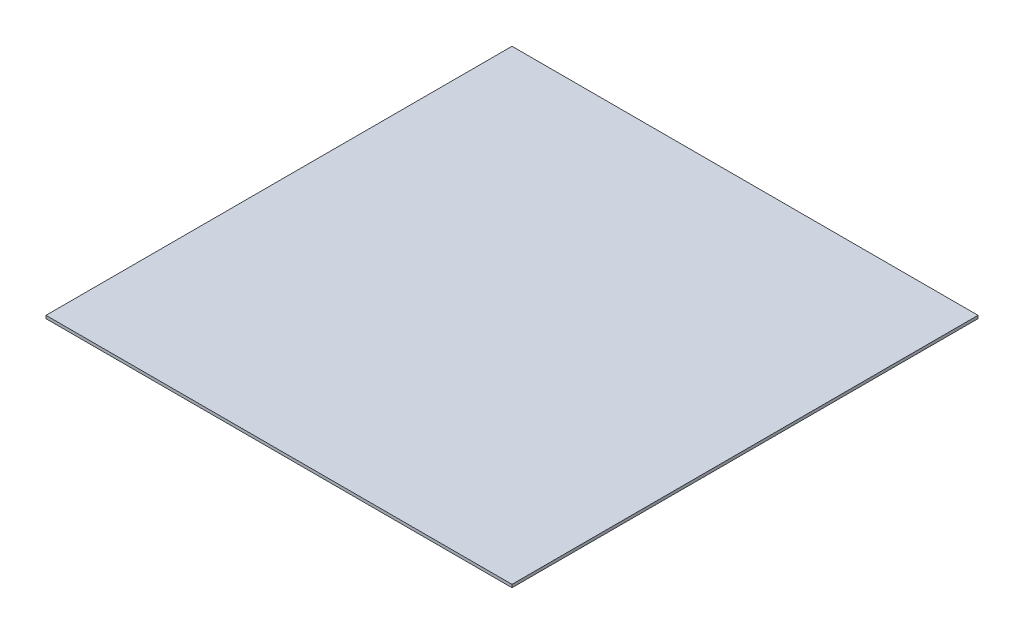
ISO-10303-21;
HEADER;
FILE_DESCRIPTION(('STEP AP214'),'2;1');
FILE_NAME('part.step','',(''),(''),'','','');
FILE_SCHEMA(('AUTOMOTIVE_DESIGN { 1 0 10303 214 1 1 1 1 }'));
ENDSEC;
DATA;
#1=APPLICATION_CONTEXT('core data for automotive mechanical design processes');
#2=APPLICATION_PROTOCOL_DEFINITION('international standard','automotive_design',2000,#1);
#3=PRODUCT_CONTEXT('',#1,'mechanical');
#4=PRODUCT('Part','Part','',(#3));
#5=PRODUCT_RELATED_PRODUCT_CATEGORY('part','',(#4));
#6=PRODUCT_DEFINITION_FORMATION('','',#4);
#7=PRODUCT_DEFINITION_CONTEXT('part definition',#1,'design');
#8=PRODUCT_DEFINITION('design','',#6,#7);
#9=PRODUCT_DEFINITION_SHAPE('','',#8);
#10=(LENGTH_UNIT() NAMED_UNIT(*) SI_UNIT(.MILLI.,.METRE.));
#11=(NAMED_UNIT(*) PLANE_ANGLE_UNIT() SI_UNIT($,.RADIAN.));
#12=(NAMED_UNIT(*) SI_UNIT($,.STERADIAN.) SOLID_ANGLE_UNIT());
#13=UNCERTAINTY_MEASURE_WITH_UNIT(LENGTH_MEASURE(1.E-05),#10,'distance_accuracy_value','');
#14=(GEOMETRIC_REPRESENTATION_CONTEXT(3) GLOBAL_UNCERTAINTY_ASSIGNED_CONTEXT((#13)) GLOBAL_UNIT_ASSIGNED_CONTEXT((#10,
#11,#12)) REPRESENTATION_CONTEXT('',''));
#15=CARTESIAN_POINT('',(0.,0.,0.));
#16=DIRECTION('',(0.,0.,1.));
#17=DIRECTION('',(1.,0.,0.));
#18=AXIS2_PLACEMENT_3D('',#15,#16,#17);
#19=CARTESIAN_POINT('',(192.,506.,-558.));
#20=DIRECTION('',(-1.,0.,0.));
#21=DIRECTION('',(0.,0.,1.));
#22=AXIS2_PLACEMENT_3D('',#19,#20,#21);
#23=PLANE('',#22);
#24=DIRECTION('',(0.,-1.,0.));
#25=VECTOR('',#24,1.);
#26=CARTESIAN_POINT('',(192.,506.,-242.));
#27=LINE('',#26,#25);
#28=CARTESIAN_POINT('',(192.,508.,-242.));
#29=VERTEX_POINT('',#28);
#30=CARTESIAN_POINT('',(192.,506.,-242.));
#31=VERTEX_POINT('',#30);
#32=EDGE_CURVE('E103',#29,#31,#27,.T.);
#33=ORIENTED_EDGE('',*,*,#32,.F.);
#34=DIRECTION('',(0.,0.,1.));
#35=VECTOR('',#34,1.);
#36=CARTESIAN_POINT('',(192.,508.,-558.));
#37=LINE('',#36,#35);
#38=CARTESIAN_POINT('',(192.,508.,-558.));
#39=VERTEX_POINT('',#38);
#40=EDGE_CURVE('E11',#39,#29,#37,.T.);
#41=ORIENTED_EDGE('',*,*,#40,.F.);
#42=DIRECTION('',(0.,-1.,0.));
#43=VECTOR('',#42,1.);
#44=CARTESIAN_POINT('',(192.,506.,-558.));
#45=LINE('',#44,#43);
#46=CARTESIAN_POINT('',(192.,506.,-558.));
#47=VERTEX_POINT('',#46);
#48=EDGE_CURVE('E97',#39,#47,#45,.T.);
#49=ORIENTED_EDGE('',*,*,#48,.T.);
#50=DIRECTION('',(0.,0.,1.));
#51=VECTOR('',#50,1.);
#52=CARTESIAN_POINT('',(192.,506.,-558.));
#53=LINE('',#52,#51);
#54=EDGE_CURVE('E42',#47,#31,#53,.T.);
#55=ORIENTED_EDGE('',*,*,#54,.T.);
#56=EDGE_LOOP('',(#33,#41,#49,#55));
#57=FACE_BOUND('',#56,.T.);
#58=ADVANCED_FACE('F39',(#57),#23,.T.);
#59=CARTESIAN_POINT('',(192.,508.,-558.));
#60=DIRECTION('',(0.,1.,0.));
#61=DIRECTION('',(0.,0.,1.));
#62=AXIS2_PLACEMENT_3D('',#59,#60,#61);
#63=PLANE('',#62);
#64=DIRECTION('',(-1.,0.,0.));
#65=VECTOR('',#64,1.);
#66=CARTESIAN_POINT('',(192.,508.,-242.));
#67=LINE('',#66,#65);
#68=CARTESIAN_POINT('',(508.,508.,-242.));
#69=VERTEX_POINT('',#68);
#70=EDGE_CURVE('E99',#69,#29,#67,.T.);
#71=ORIENTED_EDGE('',*,*,#70,.F.);
#72=DIRECTION('',(0.,0.,1.));
#73=VECTOR('',#72,1.);
#74=CARTESIAN_POINT('',(508.,508.,-558.));
#75=LINE('',#74,#73);
#76=CARTESIAN_POINT('',(508.,508.,-558.));
#77=VERTEX_POINT('',#76);
#78=EDGE_CURVE('E48',#77,#69,#75,.T.);
#79=ORIENTED_EDGE('',*,*,#78,.F.);
#80=DIRECTION('',(-1.,0.,0.));
#81=VECTOR('',#80,1.);
#82=CARTESIAN_POINT('',(192.,508.,-558.));
#83=LINE('',#82,#81);
#84=EDGE_CURVE('E94',#77,#39,#83,.T.);
#85=ORIENTED_EDGE('',*,*,#84,.T.);
#86=ORIENTED_EDGE('',*,*,#40,.T.);
#87=EDGE_LOOP('',(#71,#79,#85,#86));
#88=FACE_BOUND('',#87,.T.);
#89=ADVANCED_FACE('F113',(#88),#63,.T.);
#90=CARTESIAN_POINT('',(508.,506.,-558.));
#91=DIRECTION('',(1.,0.,0.));
#92=DIRECTION('',(0.,0.,-1.));
#93=AXIS2_PLACEMENT_3D('',#90,#91,#92);
#94=PLANE('',#93);
#95=DIRECTION('',(0.,1.,0.));
#96=VECTOR('',#95,1.);
#97=CARTESIAN_POINT('',(508.,506.,-242.));
#98=LINE('',#97,#96);
#99=CARTESIAN_POINT('',(508.,506.,-242.));
#100=VERTEX_POINT('',#99);
#101=EDGE_CURVE('E89',#100,#69,#98,.T.);
#102=ORIENTED_EDGE('',*,*,#101,.F.);
#103=DIRECTION('',(0.,0.,1.));
#104=VECTOR('',#103,1.);
#105=CARTESIAN_POINT('',(508.,506.,-558.));
#106=LINE('',#105,#104);
#107=CARTESIAN_POINT('',(508.,506.,-558.));
#108=VERTEX_POINT('',#107);
#109=EDGE_CURVE('E84',#108,#100,#106,.T.);
#110=ORIENTED_EDGE('',*,*,#109,.F.);
#111=DIRECTION('',(0.,1.,0.));
#112=VECTOR('',#111,1.);
#113=CARTESIAN_POINT('',(508.,506.,-558.));
#114=LINE('',#113,#112);
#115=EDGE_CURVE('E87',#108,#77,#114,.T.);
#116=ORIENTED_EDGE('',*,*,#115,.T.);
#117=ORIENTED_EDGE('',*,*,#78,.T.);
#118=EDGE_LOOP('',(#102,#110,#116,#117));
#119=FACE_BOUND('',#118,.T.);
#120=ADVANCED_FACE('F86',(#119),#94,.T.);
#121=CARTESIAN_POINT('',(192.,506.,-558.));
#122=DIRECTION('',(0.,-1.,0.));
#123=DIRECTION('',(0.,0.,-1.));
#124=AXIS2_PLACEMENT_3D('',#121,#122,#123);
#125=PLANE('',#124);
#126=DIRECTION('',(1.,0.,0.));
#127=VECTOR('',#126,1.);
#128=CARTESIAN_POINT('',(192.,506.,-242.));
#129=LINE('',#128,#127);
#130=EDGE_CURVE('E106',#31,#100,#129,.T.);
#131=ORIENTED_EDGE('',*,*,#130,.F.);
#132=ORIENTED_EDGE('',*,*,#54,.F.);
#133=DIRECTION('',(1.,0.,0.));
#134=VECTOR('',#133,1.);
#135=CARTESIAN_POINT('',(192.,506.,-558.));
#136=LINE('',#135,#134);
#137=EDGE_CURVE('E93',#47,#108,#136,.T.);
#138=ORIENTED_EDGE('',*,*,#137,.T.);
#139=ORIENTED_EDGE('',*,*,#109,.T.);
#140=EDGE_LOOP('',(#131,#132,#138,#139));
#141=FACE_BOUND('',#140,.T.);
#142=ADVANCED_FACE('F96',(#141),#125,.T.);
#143=CARTESIAN_POINT('',(0.,0.,-558.));
#144=DIRECTION('',(0.,0.,-1.));
#145=DIRECTION('',(-1.,0.,0.));
#146=AXIS2_PLACEMENT_3D('',#143,#144,#145);
#147=PLANE('',#146);
#148=ORIENTED_EDGE('',*,*,#48,.F.);
#149=ORIENTED_EDGE('',*,*,#84,.F.);
#150=ORIENTED_EDGE('',*,*,#115,.F.);
#151=ORIENTED_EDGE('',*,*,#137,.F.);
#152=EDGE_LOOP('',(#148,#149,#150,#151));
#153=FACE_BOUND('',#152,.T.);
#154=ADVANCED_FACE('F92',(#153),#147,.T.);
#155=CARTESIAN_POINT('',(0.,0.,-242.));
#156=DIRECTION('',(0.,0.,-1.));
#157=DIRECTION('',(-1.,0.,0.));
#158=AXIS2_PLACEMENT_3D('',#155,#156,#157);
#159=PLANE('',#158);
#160=ORIENTED_EDGE('',*,*,#32,.T.);
#161=ORIENTED_EDGE('',*,*,#130,.T.);
#162=ORIENTED_EDGE('',*,*,#101,.T.);
#163=ORIENTED_EDGE('',*,*,#70,.T.);
#164=EDGE_LOOP('',(#160,#161,#162,#163));
#165=FACE_BOUND('',#164,.T.);
#166=ADVANCED_FACE('F112',(#165),#159,.F.);
#167=CLOSED_SHELL('',(#58,#89,#120,#142,#154,#166));
#168=MANIFOLD_SOLID_BREP('B2',#167);
#169=ADVANCED_BREP_SHAPE_REPRESENTATION('',(#18,#168),#14);
#170=SHAPE_DEFINITION_REPRESENTATION(#9,#169);
ENDSEC;
END-ISO-10303-21;
